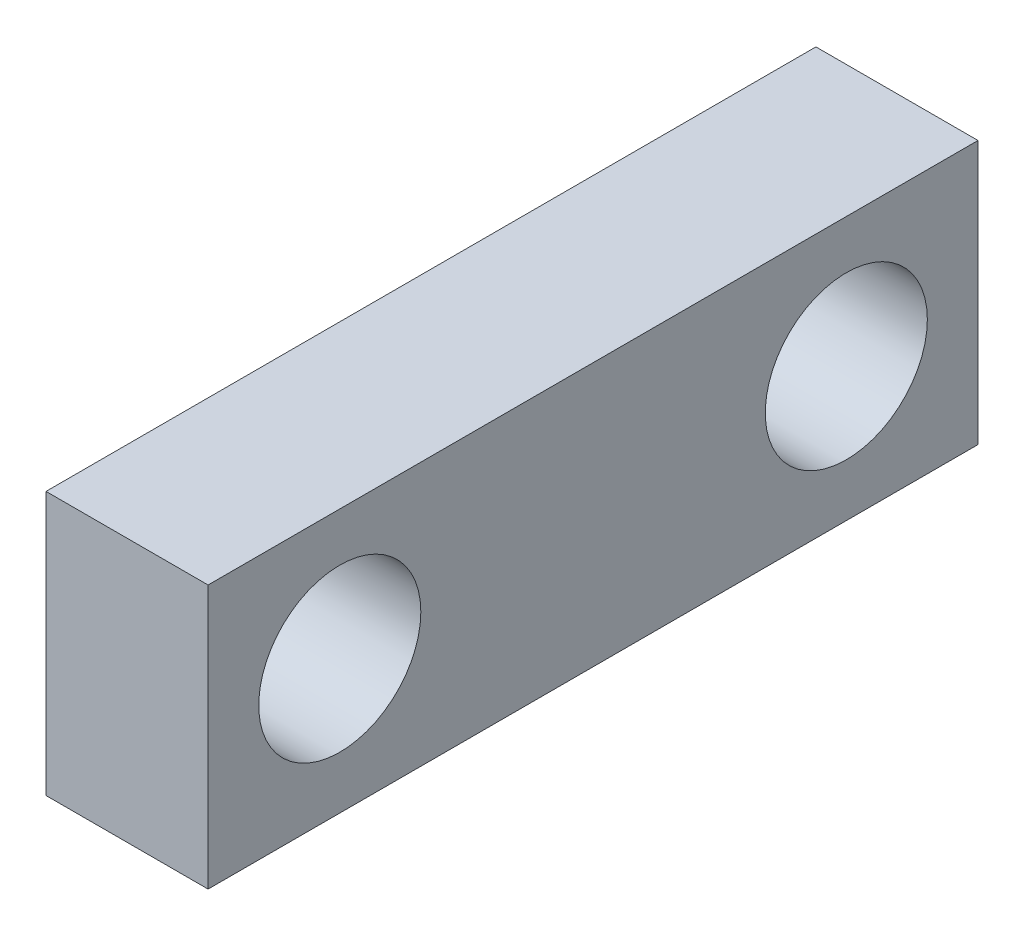
ISO-10303-21;
HEADER;
FILE_DESCRIPTION(('STEP AP214'),'2;1');
FILE_NAME('part.step','',(''),(''),'','','');
FILE_SCHEMA(('AUTOMOTIVE_DESIGN { 1 0 10303 214 1 1 1 1 }'));
ENDSEC;
DATA;
#1=APPLICATION_CONTEXT('core data for automotive mechanical design processes');
#2=APPLICATION_PROTOCOL_DEFINITION('international standard','automotive_design',2000,#1);
#3=PRODUCT_CONTEXT('',#1,'mechanical');
#4=PRODUCT('Part','Part','',(#3));
#5=PRODUCT_RELATED_PRODUCT_CATEGORY('part','',(#4));
#6=PRODUCT_DEFINITION_FORMATION('','',#4);
#7=PRODUCT_DEFINITION_CONTEXT('part definition',#1,'design');
#8=PRODUCT_DEFINITION('design','',#6,#7);
#9=PRODUCT_DEFINITION_SHAPE('','',#8);
#10=(LENGTH_UNIT() NAMED_UNIT(*) SI_UNIT(.MILLI.,.METRE.));
#11=(NAMED_UNIT(*) PLANE_ANGLE_UNIT() SI_UNIT($,.RADIAN.));
#12=(NAMED_UNIT(*) SI_UNIT($,.STERADIAN.) SOLID_ANGLE_UNIT());
#13=UNCERTAINTY_MEASURE_WITH_UNIT(LENGTH_MEASURE(1.E-05),#10,'distance_accuracy_value','');
#14=(GEOMETRIC_REPRESENTATION_CONTEXT(3) GLOBAL_UNCERTAINTY_ASSIGNED_CONTEXT((#13)) GLOBAL_UNIT_ASSIGNED_CONTEXT((#10,
#11,#12)) REPRESENTATION_CONTEXT('',''));
#15=CARTESIAN_POINT('',(0.,0.,0.));
#16=DIRECTION('',(0.,0.,1.));
#17=DIRECTION('',(1.,0.,0.));
#18=AXIS2_PLACEMENT_3D('',#15,#16,#17);
#19=CARTESIAN_POINT('',(8.,0.,0.));
#20=DIRECTION('',(1.,0.,0.));
#21=DIRECTION('',(0.,0.,-1.));
#22=AXIS2_PLACEMENT_3D('',#19,#20,#21);
#23=PLANE('',#22);
#24=CARTESIAN_POINT('',(8.,47.5437223196072,477.906543955681));
#25=DIRECTION('',(1.,0.,0.));
#26=DIRECTION('',(0.,0.,-1.));
#27=AXIS2_PLACEMENT_3D('',#24,#25,#26);
#28=CIRCLE('',#27,3.99999999999999);
#29=CARTESIAN_POINT('',(8.,47.5437223196072,473.906543955681));
#30=VERTEX_POINT('',#29);
#31=EDGE_CURVE('E106',#30,#30,#28,.T.);
#32=ORIENTED_EDGE('',*,*,#31,.F.);
#33=EDGE_LOOP('',(#32));
#34=FACE_BOUND('',#33,.T.);
#35=DIRECTION('',(0.,-1.,0.));
#36=VECTOR('',#35,1.);
#37=CARTESIAN_POINT('',(8.,53.9437223196072,484.406543955681));
#38=LINE('',#37,#36);
#39=CARTESIAN_POINT('',(8.,53.9437223196072,484.406543955681));
#40=VERTEX_POINT('',#39);
#41=CARTESIAN_POINT('',(8.,40.9437223196072,484.406543955681));
#42=VERTEX_POINT('',#41);
#43=EDGE_CURVE('E91',#40,#42,#38,.T.);
#44=ORIENTED_EDGE('',*,*,#43,.T.);
#45=DIRECTION('',(0.,0.,-1.));
#46=VECTOR('',#45,1.);
#47=CARTESIAN_POINT('',(8.,40.9437223196072,484.406543955681));
#48=LINE('',#47,#46);
#49=CARTESIAN_POINT('',(8.,40.9437223196072,446.406543955681));
#50=VERTEX_POINT('',#49);
#51=EDGE_CURVE('E86',#42,#50,#48,.T.);
#52=ORIENTED_EDGE('',*,*,#51,.T.);
#53=DIRECTION('',(0.,1.,0.));
#54=VECTOR('',#53,1.);
#55=CARTESIAN_POINT('',(8.,53.9437223196072,446.406543955681));
#56=LINE('',#55,#54);
#57=CARTESIAN_POINT('',(8.,53.9437223196072,446.406543955681));
#58=VERTEX_POINT('',#57);
#59=EDGE_CURVE('E89',#50,#58,#56,.T.);
#60=ORIENTED_EDGE('',*,*,#59,.T.);
#61=DIRECTION('',(0.,0.,1.));
#62=VECTOR('',#61,1.);
#63=CARTESIAN_POINT('',(8.,53.9437223196072,484.406543955681));
#64=LINE('',#63,#62);
#65=EDGE_CURVE('E56',#58,#40,#64,.T.);
#66=ORIENTED_EDGE('',*,*,#65,.T.);
#67=EDGE_LOOP('',(#44,#52,#60,#66));
#68=FACE_BOUND('',#67,.T.);
#69=CARTESIAN_POINT('',(8.,47.5437223196072,452.906543955681));
#70=DIRECTION('',(1.,0.,0.));
#71=DIRECTION('',(0.,0.,-1.));
#72=AXIS2_PLACEMENT_3D('',#69,#70,#71);
#73=CIRCLE('',#72,3.99999999999999);
#74=CARTESIAN_POINT('',(8.,47.5437223196072,448.906543955681));
#75=VERTEX_POINT('',#74);
#76=EDGE_CURVE('E121',#75,#75,#73,.T.);
#77=ORIENTED_EDGE('',*,*,#76,.F.);
#78=EDGE_LOOP('',(#77));
#79=FACE_BOUND('',#78,.T.);
#80=ADVANCED_FACE('F39',(#34,#68,#79),#23,.T.);
#81=CARTESIAN_POINT('',(0.,0.,0.));
#82=DIRECTION('',(1.,0.,0.));
#83=DIRECTION('',(0.,0.,-1.));
#84=AXIS2_PLACEMENT_3D('',#81,#82,#83);
#85=PLANE('',#84);
#86=DIRECTION('',(0.,-1.,0.));
#87=VECTOR('',#86,1.);
#88=CARTESIAN_POINT('',(0.,53.9437223196072,484.406543955681));
#89=LINE('',#88,#87);
#90=CARTESIAN_POINT('',(0.,53.9437223196072,484.406543955681));
#91=VERTEX_POINT('',#90);
#92=CARTESIAN_POINT('',(0.,40.9437223196072,484.406543955681));
#93=VERTEX_POINT('',#92);
#94=EDGE_CURVE('E103',#91,#93,#89,.T.);
#95=ORIENTED_EDGE('',*,*,#94,.F.);
#96=DIRECTION('',(0.,0.,1.));
#97=VECTOR('',#96,1.);
#98=CARTESIAN_POINT('',(0.,53.9437223196072,484.406543955681));
#99=LINE('',#98,#97);
#100=CARTESIAN_POINT('',(0.,53.9437223196072,446.406543955681));
#101=VERTEX_POINT('',#100);
#102=EDGE_CURVE('E79',#101,#91,#99,.T.);
#103=ORIENTED_EDGE('',*,*,#102,.F.);
#104=DIRECTION('',(0.,1.,0.));
#105=VECTOR('',#104,1.);
#106=CARTESIAN_POINT('',(0.,53.9437223196072,446.406543955681));
#107=LINE('',#106,#105);
#108=CARTESIAN_POINT('',(0.,40.9437223196072,446.406543955681));
#109=VERTEX_POINT('',#108);
#110=EDGE_CURVE('E73',#109,#101,#107,.T.);
#111=ORIENTED_EDGE('',*,*,#110,.F.);
#112=DIRECTION('',(0.,0.,-1.));
#113=VECTOR('',#112,1.);
#114=CARTESIAN_POINT('',(0.,40.9437223196072,484.406543955681));
#115=LINE('',#114,#113);
#116=EDGE_CURVE('E95',#93,#109,#115,.T.);
#117=ORIENTED_EDGE('',*,*,#116,.F.);
#118=EDGE_LOOP('',(#95,#103,#111,#117));
#119=FACE_BOUND('',#118,.T.);
#120=CARTESIAN_POINT('',(0.,47.5437223196072,477.906543955681));
#121=DIRECTION('',(1.,0.,0.));
#122=DIRECTION('',(0.,0.,-1.));
#123=AXIS2_PLACEMENT_3D('',#120,#121,#122);
#124=CIRCLE('',#123,3.99999999999999);
#125=CARTESIAN_POINT('',(0.,47.5437223196072,473.906543955681));
#126=VERTEX_POINT('',#125);
#127=EDGE_CURVE('E118',#126,#126,#124,.T.);
#128=ORIENTED_EDGE('',*,*,#127,.T.);
#129=EDGE_LOOP('',(#128));
#130=FACE_BOUND('',#129,.T.);
#131=CARTESIAN_POINT('',(0.,47.5437223196072,452.906543955681));
#132=DIRECTION('',(1.,0.,0.));
#133=DIRECTION('',(0.,0.,-1.));
#134=AXIS2_PLACEMENT_3D('',#131,#132,#133);
#135=CIRCLE('',#134,3.99999999999999);
#136=CARTESIAN_POINT('',(0.,47.5437223196072,448.906543955681));
#137=VERTEX_POINT('',#136);
#138=EDGE_CURVE('E124',#137,#137,#135,.T.);
#139=ORIENTED_EDGE('',*,*,#138,.T.);
#140=EDGE_LOOP('',(#139));
#141=FACE_BOUND('',#140,.T.);
#142=ADVANCED_FACE('F114',(#119,#130,#141),#85,.F.);
#143=CARTESIAN_POINT('',(8.,53.9437223196072,484.406543955681));
#144=DIRECTION('',(0.,0.,-1.));
#145=DIRECTION('',(-1.,0.,0.));
#146=AXIS2_PLACEMENT_3D('',#143,#144,#145);
#147=PLANE('',#146);
#148=ORIENTED_EDGE('',*,*,#94,.T.);
#149=DIRECTION('',(-1.,0.,0.));
#150=VECTOR('',#149,1.);
#151=CARTESIAN_POINT('',(8.,40.9437223196072,484.406543955681));
#152=LINE('',#151,#150);
#153=EDGE_CURVE('E11',#42,#93,#152,.T.);
#154=ORIENTED_EDGE('',*,*,#153,.F.);
#155=ORIENTED_EDGE('',*,*,#43,.F.);
#156=DIRECTION('',(-1.,0.,0.));
#157=VECTOR('',#156,1.);
#158=CARTESIAN_POINT('',(8.,53.9437223196072,484.406543955681));
#159=LINE('',#158,#157);
#160=EDGE_CURVE('E99',#40,#91,#159,.T.);
#161=ORIENTED_EDGE('',*,*,#160,.T.);
#162=EDGE_LOOP('',(#148,#154,#155,#161));
#163=FACE_BOUND('',#162,.T.);
#164=ADVANCED_FACE('F41',(#163),#147,.F.);
#165=CARTESIAN_POINT('',(8.,40.9437223196072,484.406543955681));
#166=DIRECTION('',(0.,1.,0.));
#167=DIRECTION('',(0.,0.,1.));
#168=AXIS2_PLACEMENT_3D('',#165,#166,#167);
#169=PLANE('',#168);
#170=ORIENTED_EDGE('',*,*,#116,.T.);
#171=DIRECTION('',(-1.,0.,0.));
#172=VECTOR('',#171,1.);
#173=CARTESIAN_POINT('',(8.,40.9437223196072,446.406543955681));
#174=LINE('',#173,#172);
#175=EDGE_CURVE('E48',#50,#109,#174,.T.);
#176=ORIENTED_EDGE('',*,*,#175,.F.);
#177=ORIENTED_EDGE('',*,*,#51,.F.);
#178=ORIENTED_EDGE('',*,*,#153,.T.);
#179=EDGE_LOOP('',(#170,#176,#177,#178));
#180=FACE_BOUND('',#179,.T.);
#181=ADVANCED_FACE('F94',(#180),#169,.F.);
#182=CARTESIAN_POINT('',(8.,53.9437223196072,446.406543955681));
#183=DIRECTION('',(0.,0.,1.));
#184=DIRECTION('',(1.,0.,0.));
#185=AXIS2_PLACEMENT_3D('',#182,#183,#184);
#186=PLANE('',#185);
#187=ORIENTED_EDGE('',*,*,#110,.T.);
#188=DIRECTION('',(-1.,0.,0.));
#189=VECTOR('',#188,1.);
#190=CARTESIAN_POINT('',(8.,53.9437223196072,446.406543955681));
#191=LINE('',#190,#189);
#192=EDGE_CURVE('E96',#58,#101,#191,.T.);
#193=ORIENTED_EDGE('',*,*,#192,.F.);
#194=ORIENTED_EDGE('',*,*,#59,.F.);
#195=ORIENTED_EDGE('',*,*,#175,.T.);
#196=EDGE_LOOP('',(#187,#193,#194,#195));
#197=FACE_BOUND('',#196,.T.);
#198=ADVANCED_FACE('F97',(#197),#186,.F.);
#199=CARTESIAN_POINT('',(8.,53.9437223196072,484.406543955681));
#200=DIRECTION('',(0.,-1.,0.));
#201=DIRECTION('',(0.,0.,-1.));
#202=AXIS2_PLACEMENT_3D('',#199,#200,#201);
#203=PLANE('',#202);
#204=ORIENTED_EDGE('',*,*,#102,.T.);
#205=ORIENTED_EDGE('',*,*,#160,.F.);
#206=ORIENTED_EDGE('',*,*,#65,.F.);
#207=ORIENTED_EDGE('',*,*,#192,.T.);
#208=EDGE_LOOP('',(#204,#205,#206,#207));
#209=FACE_BOUND('',#208,.T.);
#210=ADVANCED_FACE('F111',(#209),#203,.F.);
#211=CARTESIAN_POINT('',(8.,47.5437223196072,477.906543955681));
#212=DIRECTION('',(-1.,0.,0.));
#213=DIRECTION('',(0.,0.,1.));
#214=AXIS2_PLACEMENT_3D('',#211,#212,#213);
#215=CYLINDRICAL_SURFACE('',#214,3.99999999999999);
#216=ORIENTED_EDGE('',*,*,#31,.T.);
#217=EDGE_LOOP('',(#216));
#218=FACE_BOUND('',#217,.T.);
#219=ORIENTED_EDGE('',*,*,#127,.F.);
#220=EDGE_LOOP('',(#219));
#221=FACE_BOUND('',#220,.T.);
#222=ADVANCED_FACE('F141',(#218,#221),#215,.F.);
#223=CARTESIAN_POINT('',(8.,47.5437223196072,452.906543955681));
#224=DIRECTION('',(-1.,0.,0.));
#225=DIRECTION('',(0.,0.,1.));
#226=AXIS2_PLACEMENT_3D('',#223,#224,#225);
#227=CYLINDRICAL_SURFACE('',#226,3.99999999999999);
#228=ORIENTED_EDGE('',*,*,#76,.T.);
#229=EDGE_LOOP('',(#228));
#230=FACE_BOUND('',#229,.T.);
#231=ORIENTED_EDGE('',*,*,#138,.F.);
#232=EDGE_LOOP('',(#231));
#233=FACE_BOUND('',#232,.T.);
#234=ADVANCED_FACE('F130',(#230,#233),#227,.F.);
#235=CLOSED_SHELL('',(#80,#142,#164,#181,#198,#210,#222,#234));
#236=MANIFOLD_SOLID_BREP('B2',#235);
#237=ADVANCED_BREP_SHAPE_REPRESENTATION('',(#18,#236),#14);
#238=SHAPE_DEFINITION_REPRESENTATION(#9,#237);
ENDSEC;
END-ISO-10303-21;
